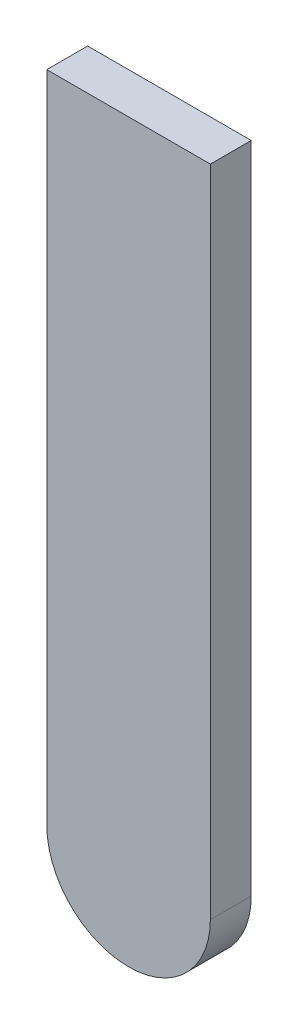
ISO-10303-21;
HEADER;
FILE_DESCRIPTION(('STEP AP214'),'2;1');
FILE_NAME('part.step','',(''),(''),'','','');
FILE_SCHEMA(('AUTOMOTIVE_DESIGN { 1 0 10303 214 1 1 1 1 }'));
ENDSEC;
DATA;
#1=APPLICATION_CONTEXT('core data for automotive mechanical design processes');
#2=APPLICATION_PROTOCOL_DEFINITION('international standard','automotive_design',2000,#1);
#3=PRODUCT_CONTEXT('',#1,'mechanical');
#4=PRODUCT('Part','Part','',(#3));
#5=PRODUCT_RELATED_PRODUCT_CATEGORY('part','',(#4));
#6=PRODUCT_DEFINITION_FORMATION('','',#4);
#7=PRODUCT_DEFINITION_CONTEXT('part definition',#1,'design');
#8=PRODUCT_DEFINITION('design','',#6,#7);
#9=PRODUCT_DEFINITION_SHAPE('','',#8);
#10=(LENGTH_UNIT() NAMED_UNIT(*) SI_UNIT(.MILLI.,.METRE.));
#11=(NAMED_UNIT(*) PLANE_ANGLE_UNIT() SI_UNIT($,.RADIAN.));
#12=(NAMED_UNIT(*) SI_UNIT($,.STERADIAN.) SOLID_ANGLE_UNIT());
#13=UNCERTAINTY_MEASURE_WITH_UNIT(LENGTH_MEASURE(1.E-05),#10,'distance_accuracy_value','');
#14=(GEOMETRIC_REPRESENTATION_CONTEXT(3) GLOBAL_UNCERTAINTY_ASSIGNED_CONTEXT((#13)) GLOBAL_UNIT_ASSIGNED_CONTEXT((#10,
#11,#12)) REPRESENTATION_CONTEXT('',''));
#15=CARTESIAN_POINT('',(0.,0.,0.));
#16=DIRECTION('',(0.,0.,1.));
#17=DIRECTION('',(1.,0.,0.));
#18=AXIS2_PLACEMENT_3D('',#15,#16,#17);
#19=CARTESIAN_POINT('',(-0.5,-3.5,-8.625));
#20=DIRECTION('',(0.,0.,1.));
#21=DIRECTION('',(1.,0.,0.));
#22=AXIS2_PLACEMENT_3D('',#19,#20,#21);
#23=PLANE('',#22);
#24=CARTESIAN_POINT('',(0.,-3.,-8.625));
#25=DIRECTION('',(0.,0.,1.));
#26=DIRECTION('',(1.,0.,0.));
#27=AXIS2_PLACEMENT_3D('',#24,#25,#26);
#28=CIRCLE('',#27,0.5);
#29=CARTESIAN_POINT('',(-0.5,-3.,-8.625));
#30=VERTEX_POINT('',#29);
#31=CARTESIAN_POINT('',(0.500000000000001,-3.,-8.625));
#32=VERTEX_POINT('',#31);
#33=EDGE_CURVE('E20',#30,#32,#28,.T.);
#34=ORIENTED_EDGE('',*,*,#33,.F.);
#35=DIRECTION('',(0.,1.,0.));
#36=VECTOR('',#35,1.);
#37=CARTESIAN_POINT('',(-0.5,-3.5,-8.625));
#38=LINE('',#37,#36);
#39=CARTESIAN_POINT('',(-0.5,1.00000000003,-8.625));
#40=VERTEX_POINT('',#39);
#41=EDGE_CURVE('E76',#30,#40,#38,.T.);
#42=ORIENTED_EDGE('',*,*,#41,.T.);
#43=DIRECTION('',(1.,0.,0.));
#44=VECTOR('',#43,1.);
#45=CARTESIAN_POINT('',(-1.3,1.,-8.625));
#46=LINE('',#45,#44);
#47=CARTESIAN_POINT('',(0.5,1.00000000006,-8.625));
#48=VERTEX_POINT('',#47);
#49=EDGE_CURVE('E52',#48,#40,#46,.F.);
#50=ORIENTED_EDGE('',*,*,#49,.F.);
#51=DIRECTION('',(0.,1.,0.));
#52=VECTOR('',#51,1.);
#53=CARTESIAN_POINT('',(0.5,-3.5,-8.625));
#54=LINE('',#53,#52);
#55=EDGE_CURVE('E78',#48,#32,#54,.F.);
#56=ORIENTED_EDGE('',*,*,#55,.T.);
#57=EDGE_LOOP('',(#34,#42,#50,#56));
#58=FACE_BOUND('',#57,.T.);
#59=ADVANCED_FACE('F17',(#58),#23,.F.);
#60=CARTESIAN_POINT('',(-0.5,-3.5,-8.375));
#61=DIRECTION('',(1.,0.,0.));
#62=DIRECTION('',(0.,0.,-1.));
#63=AXIS2_PLACEMENT_3D('',#60,#61,#62);
#64=PLANE('',#63);
#65=DIRECTION('',(0.,0.,-1.));
#66=VECTOR('',#65,1.);
#67=CARTESIAN_POINT('',(-0.499999999999999,-3.,-8.625));
#68=LINE('',#67,#66);
#69=CARTESIAN_POINT('',(-0.5,-3.,-8.375));
#70=VERTEX_POINT('',#69);
#71=EDGE_CURVE('E64',#70,#30,#68,.T.);
#72=ORIENTED_EDGE('',*,*,#71,.F.);
#73=DIRECTION('',(0.,1.,0.));
#74=VECTOR('',#73,1.);
#75=CARTESIAN_POINT('',(-0.5,-3.5,-8.375));
#76=LINE('',#75,#74);
#77=CARTESIAN_POINT('',(-0.5,1.00000000006,-8.375));
#78=VERTEX_POINT('',#77);
#79=EDGE_CURVE('E69',#70,#78,#76,.T.);
#80=ORIENTED_EDGE('',*,*,#79,.T.);
#81=DIRECTION('',(0.,0.,1.));
#82=VECTOR('',#81,1.);
#83=CARTESIAN_POINT('',(-0.5,1.,-8.325));
#84=LINE('',#83,#82);
#85=EDGE_CURVE('E59',#40,#78,#84,.T.);
#86=ORIENTED_EDGE('',*,*,#85,.F.);
#87=ORIENTED_EDGE('',*,*,#41,.F.);
#88=EDGE_LOOP('',(#72,#80,#86,#87));
#89=FACE_BOUND('',#88,.T.);
#90=ADVANCED_FACE('F75',(#89),#64,.F.);
#91=CARTESIAN_POINT('',(-1.3,1.,-8.325));
#92=DIRECTION('',(0.,1.,0.));
#93=DIRECTION('',(0.,0.,1.));
#94=AXIS2_PLACEMENT_3D('',#91,#92,#93);
#95=PLANE('',#94);
#96=ORIENTED_EDGE('',*,*,#49,.T.);
#97=ORIENTED_EDGE('',*,*,#85,.T.);
#98=DIRECTION('',(-1.,0.,0.));
#99=VECTOR('',#98,1.);
#100=CARTESIAN_POINT('',(-0.5,1.00000000009,-8.375));
#101=LINE('',#100,#99);
#102=CARTESIAN_POINT('',(0.5,1.00000000009,-8.375));
#103=VERTEX_POINT('',#102);
#104=EDGE_CURVE('E71',#78,#103,#101,.F.);
#105=ORIENTED_EDGE('',*,*,#104,.T.);
#106=DIRECTION('',(0.,0.,1.));
#107=VECTOR('',#106,1.);
#108=CARTESIAN_POINT('',(0.5,1.00000000009,-8.375));
#109=LINE('',#108,#107);
#110=EDGE_CURVE('E83',#103,#48,#109,.F.);
#111=ORIENTED_EDGE('',*,*,#110,.T.);
#112=EDGE_LOOP('',(#96,#97,#105,#111));
#113=FACE_BOUND('',#112,.T.);
#114=ADVANCED_FACE('F102',(#113),#95,.T.);
#115=CARTESIAN_POINT('',(0.5,-3.5,-8.375));
#116=DIRECTION('',(-1.,0.,0.));
#117=DIRECTION('',(0.,0.,1.));
#118=AXIS2_PLACEMENT_3D('',#115,#116,#117);
#119=PLANE('',#118);
#120=DIRECTION('',(0.,0.,1.));
#121=VECTOR('',#120,1.);
#122=CARTESIAN_POINT('',(0.500000000000001,-3.,-8.625));
#123=LINE('',#122,#121);
#124=CARTESIAN_POINT('',(0.500000000000001,-3.,-8.375));
#125=VERTEX_POINT('',#124);
#126=EDGE_CURVE('E33',#32,#125,#123,.T.);
#127=ORIENTED_EDGE('',*,*,#126,.F.);
#128=ORIENTED_EDGE('',*,*,#55,.F.);
#129=ORIENTED_EDGE('',*,*,#110,.F.);
#130=DIRECTION('',(0.,1.,0.));
#131=VECTOR('',#130,1.);
#132=CARTESIAN_POINT('',(0.5,-3.5,-8.375));
#133=LINE('',#132,#131);
#134=EDGE_CURVE('E26',#103,#125,#133,.F.);
#135=ORIENTED_EDGE('',*,*,#134,.T.);
#136=EDGE_LOOP('',(#127,#128,#129,#135));
#137=FACE_BOUND('',#136,.T.);
#138=ADVANCED_FACE('F104',(#137),#119,.F.);
#139=CARTESIAN_POINT('',(0.,-3.,-8.625));
#140=DIRECTION('',(0.,0.,-1.));
#141=DIRECTION('',(-1.,0.,0.));
#142=AXIS2_PLACEMENT_3D('',#139,#140,#141);
#143=CYLINDRICAL_SURFACE('',#142,0.5);
#144=ORIENTED_EDGE('',*,*,#71,.T.);
#145=ORIENTED_EDGE('',*,*,#33,.T.);
#146=ORIENTED_EDGE('',*,*,#126,.T.);
#147=CARTESIAN_POINT('',(0.,-3.,-8.375));
#148=DIRECTION('',(0.,0.,1.));
#149=DIRECTION('',(1.,0.,0.));
#150=AXIS2_PLACEMENT_3D('',#147,#148,#149);
#151=CIRCLE('',#150,0.5);
#152=EDGE_CURVE('E11',#125,#70,#151,.F.);
#153=ORIENTED_EDGE('',*,*,#152,.T.);
#154=EDGE_LOOP('',(#144,#145,#146,#153));
#155=FACE_BOUND('',#154,.T.);
#156=ADVANCED_FACE('F62',(#155),#143,.T.);
#157=CARTESIAN_POINT('',(-0.5,-3.5,-8.375));
#158=DIRECTION('',(0.,0.,-1.));
#159=DIRECTION('',(-1.,0.,0.));
#160=AXIS2_PLACEMENT_3D('',#157,#158,#159);
#161=PLANE('',#160);
#162=ORIENTED_EDGE('',*,*,#152,.F.);
#163=ORIENTED_EDGE('',*,*,#134,.F.);
#164=ORIENTED_EDGE('',*,*,#104,.F.);
#165=ORIENTED_EDGE('',*,*,#79,.F.);
#166=EDGE_LOOP('',(#162,#163,#164,#165));
#167=FACE_BOUND('',#166,.T.);
#168=ADVANCED_FACE('F70',(#167),#161,.F.);
#169=CLOSED_SHELL('',(#59,#90,#114,#138,#156,#168));
#170=MANIFOLD_SOLID_BREP('B1',#169);
#171=ADVANCED_BREP_SHAPE_REPRESENTATION('',(#18,#170),#14);
#172=SHAPE_DEFINITION_REPRESENTATION(#9,#171);
ENDSEC;
END-ISO-10303-21;
